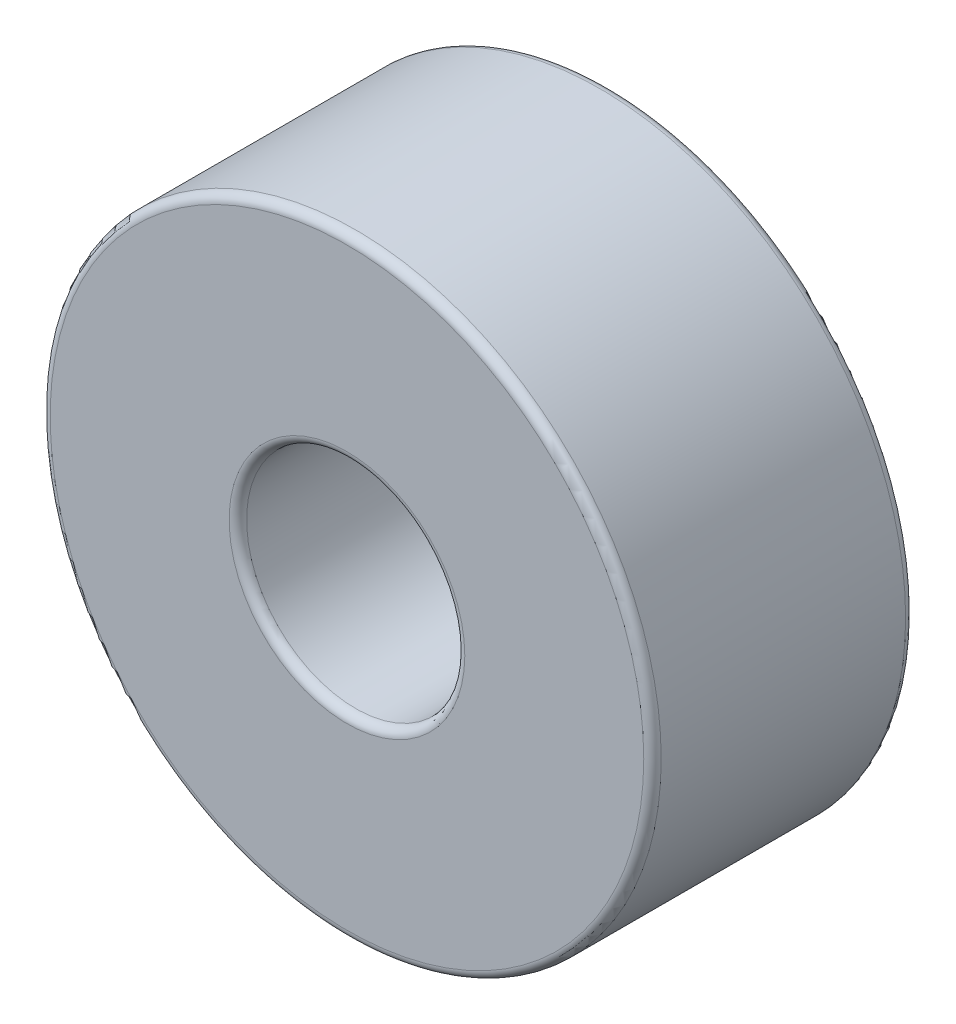
ISO-10303-21;
HEADER;
FILE_DESCRIPTION(('STEP AP214'),'2;1');
FILE_NAME('part.step','',(''),(''),'','','');
FILE_SCHEMA(('AUTOMOTIVE_DESIGN { 1 0 10303 214 1 1 1 1 }'));
ENDSEC;
DATA;
#1=APPLICATION_CONTEXT('core data for automotive mechanical design processes');
#2=APPLICATION_PROTOCOL_DEFINITION('international standard','automotive_design',2000,#1);
#3=PRODUCT_CONTEXT('',#1,'mechanical');
#4=PRODUCT('Part','Part','',(#3));
#5=PRODUCT_RELATED_PRODUCT_CATEGORY('part','',(#4));
#6=PRODUCT_DEFINITION_FORMATION('','',#4);
#7=PRODUCT_DEFINITION_CONTEXT('part definition',#1,'design');
#8=PRODUCT_DEFINITION('design','',#6,#7);
#9=PRODUCT_DEFINITION_SHAPE('','',#8);
#10=(LENGTH_UNIT() NAMED_UNIT(*) SI_UNIT(.MILLI.,.METRE.));
#11=(NAMED_UNIT(*) PLANE_ANGLE_UNIT() SI_UNIT($,.RADIAN.));
#12=(NAMED_UNIT(*) SI_UNIT($,.STERADIAN.) SOLID_ANGLE_UNIT());
#13=UNCERTAINTY_MEASURE_WITH_UNIT(LENGTH_MEASURE(1.E-05),#10,'distance_accuracy_value','');
#14=(GEOMETRIC_REPRESENTATION_CONTEXT(3) GLOBAL_UNCERTAINTY_ASSIGNED_CONTEXT((#13)) GLOBAL_UNIT_ASSIGNED_CONTEXT((#10,
#11,#12)) REPRESENTATION_CONTEXT('',''));
#15=CARTESIAN_POINT('',(0.,0.,0.));
#16=DIRECTION('',(0.,0.,1.));
#17=DIRECTION('',(1.,0.,0.));
#18=AXIS2_PLACEMENT_3D('',#15,#16,#17);
#19=CARTESIAN_POINT('',(0.,0.,6.));
#20=DIRECTION('',(0.,0.,-1.));
#21=DIRECTION('',(-1.,0.,0.));
#22=AXIS2_PLACEMENT_3D('',#19,#20,#21);
#23=CYLINDRICAL_SURFACE('',#22,7.);
#24=CARTESIAN_POINT('',(0.,0.,0.2));
#25=DIRECTION('',(0.,0.,1.));
#26=DIRECTION('',(1.,0.,0.));
#27=AXIS2_PLACEMENT_3D('',#24,#25,#26);
#28=CIRCLE('',#27,7.);
#29=CARTESIAN_POINT('',(7.,0.,0.2));
#30=VERTEX_POINT('',#29);
#31=EDGE_CURVE('E50',#30,#30,#28,.T.);
#32=ORIENTED_EDGE('',*,*,#31,.T.);
#33=EDGE_LOOP('',(#32));
#34=FACE_BOUND('',#33,.T.);
#35=CARTESIAN_POINT('',(0.,0.,5.8));
#36=DIRECTION('',(0.,0.,1.));
#37=DIRECTION('',(1.,0.,0.));
#38=AXIS2_PLACEMENT_3D('',#35,#36,#37);
#39=CIRCLE('',#38,7.);
#40=CARTESIAN_POINT('',(7.,0.,5.8));
#41=VERTEX_POINT('',#40);
#42=EDGE_CURVE('E54',#41,#41,#39,.F.);
#43=ORIENTED_EDGE('',*,*,#42,.T.);
#44=EDGE_LOOP('',(#43));
#45=FACE_BOUND('',#44,.T.);
#46=ADVANCED_FACE('F39',(#34,#45),#23,.T.);
#47=CARTESIAN_POINT('',(0.,0.,6.));
#48=DIRECTION('',(0.,0.,1.));
#49=DIRECTION('',(1.,0.,0.));
#50=AXIS2_PLACEMENT_3D('',#47,#48,#49);
#51=PLANE('',#50);
#52=CARTESIAN_POINT('',(0.,0.,6.));
#53=DIRECTION('',(0.,0.,1.));
#54=DIRECTION('',(1.,0.,0.));
#55=AXIS2_PLACEMENT_3D('',#52,#53,#54);
#56=CIRCLE('',#55,6.8);
#57=CARTESIAN_POINT('',(6.8,0.,6.));
#58=VERTEX_POINT('',#57);
#59=EDGE_CURVE('E10',#58,#58,#56,.T.);
#60=ORIENTED_EDGE('',*,*,#59,.T.);
#61=EDGE_LOOP('',(#60));
#62=FACE_BOUND('',#61,.T.);
#63=CARTESIAN_POINT('',(0.,0.,6.));
#64=DIRECTION('',(0.,0.,1.));
#65=DIRECTION('',(1.,0.,0.));
#66=AXIS2_PLACEMENT_3D('',#63,#64,#65);
#67=CIRCLE('',#66,2.7);
#68=CARTESIAN_POINT('',(2.7,0.,6.));
#69=VERTEX_POINT('',#68);
#70=EDGE_CURVE('E46',#69,#69,#67,.F.);
#71=ORIENTED_EDGE('',*,*,#70,.T.);
#72=EDGE_LOOP('',(#71));
#73=FACE_BOUND('',#72,.T.);
#74=ADVANCED_FACE('F84',(#62,#73),#51,.T.);
#75=CARTESIAN_POINT('',(0.,0.,0.));
#76=DIRECTION('',(0.,0.,1.));
#77=DIRECTION('',(1.,0.,0.));
#78=AXIS2_PLACEMENT_3D('',#75,#76,#77);
#79=PLANE('',#78);
#80=CARTESIAN_POINT('',(0.,0.,0.));
#81=DIRECTION('',(0.,0.,1.));
#82=DIRECTION('',(1.,0.,0.));
#83=AXIS2_PLACEMENT_3D('',#80,#81,#82);
#84=CIRCLE('',#83,2.7);
#85=CARTESIAN_POINT('',(2.7,0.,0.));
#86=VERTEX_POINT('',#85);
#87=EDGE_CURVE('E65',#86,#86,#84,.T.);
#88=ORIENTED_EDGE('',*,*,#87,.T.);
#89=EDGE_LOOP('',(#88));
#90=FACE_BOUND('',#89,.T.);
#91=CARTESIAN_POINT('',(0.,0.,0.));
#92=DIRECTION('',(0.,0.,1.));
#93=DIRECTION('',(1.,0.,0.));
#94=AXIS2_PLACEMENT_3D('',#91,#92,#93);
#95=CIRCLE('',#94,6.8);
#96=CARTESIAN_POINT('',(6.8,0.,0.));
#97=VERTEX_POINT('',#96);
#98=EDGE_CURVE('E68',#97,#97,#95,.F.);
#99=ORIENTED_EDGE('',*,*,#98,.T.);
#100=EDGE_LOOP('',(#99));
#101=FACE_BOUND('',#100,.T.);
#102=ADVANCED_FACE('F72',(#90,#101),#79,.F.);
#103=CARTESIAN_POINT('',(0.,0.,0.));
#104=DIRECTION('',(0.,0.,1.));
#105=DIRECTION('',(1.,0.,0.));
#106=AXIS2_PLACEMENT_3D('',#103,#104,#105);
#107=CYLINDRICAL_SURFACE('',#106,2.5);
#108=CARTESIAN_POINT('',(0.,0.,0.2));
#109=DIRECTION('',(0.,0.,1.));
#110=DIRECTION('',(1.,0.,0.));
#111=AXIS2_PLACEMENT_3D('',#108,#109,#110);
#112=CIRCLE('',#111,2.5);
#113=CARTESIAN_POINT('',(2.5,0.,0.2));
#114=VERTEX_POINT('',#113);
#115=EDGE_CURVE('E59',#114,#114,#112,.F.);
#116=ORIENTED_EDGE('',*,*,#115,.T.);
#117=EDGE_LOOP('',(#116));
#118=FACE_BOUND('',#117,.T.);
#119=CARTESIAN_POINT('',(0.,0.,5.8));
#120=DIRECTION('',(0.,0.,1.));
#121=DIRECTION('',(1.,0.,0.));
#122=AXIS2_PLACEMENT_3D('',#119,#120,#121);
#123=CIRCLE('',#122,2.5);
#124=CARTESIAN_POINT('',(2.5,0.,5.8));
#125=VERTEX_POINT('',#124);
#126=EDGE_CURVE('E62',#125,#125,#123,.T.);
#127=ORIENTED_EDGE('',*,*,#126,.T.);
#128=EDGE_LOOP('',(#127));
#129=FACE_BOUND('',#128,.T.);
#130=ADVANCED_FACE('F96',(#118,#129),#107,.F.);
#131=CARTESIAN_POINT('',(0.,0.,0.2));
#132=DIRECTION('',(0.,0.,1.));
#133=DIRECTION('',(1.,0.,0.));
#134=AXIS2_PLACEMENT_3D('',#131,#132,#133);
#135=TOROIDAL_SURFACE('',#134,2.7,0.2);
#136=ORIENTED_EDGE('',*,*,#115,.F.);
#137=EDGE_LOOP('',(#136));
#138=FACE_BOUND('',#137,.T.);
#139=ORIENTED_EDGE('',*,*,#87,.F.);
#140=EDGE_LOOP('',(#139));
#141=FACE_BOUND('',#140,.T.);
#142=ADVANCED_FACE('F78',(#138,#141),#135,.T.);
#143=CARTESIAN_POINT('',(0.,0.,0.2));
#144=DIRECTION('',(0.,0.,1.));
#145=DIRECTION('',(1.,0.,0.));
#146=AXIS2_PLACEMENT_3D('',#143,#144,#145);
#147=TOROIDAL_SURFACE('',#146,6.8,0.2);
#148=ORIENTED_EDGE('',*,*,#98,.F.);
#149=EDGE_LOOP('',(#148));
#150=FACE_BOUND('',#149,.T.);
#151=ORIENTED_EDGE('',*,*,#31,.F.);
#152=EDGE_LOOP('',(#151));
#153=FACE_BOUND('',#152,.T.);
#154=ADVANCED_FACE('F74',(#150,#153),#147,.T.);
#155=CARTESIAN_POINT('',(0.,0.,5.8));
#156=DIRECTION('',(0.,0.,1.));
#157=DIRECTION('',(1.,0.,0.));
#158=AXIS2_PLACEMENT_3D('',#155,#156,#157);
#159=TOROIDAL_SURFACE('',#158,6.8,0.2);
#160=ORIENTED_EDGE('',*,*,#42,.F.);
#161=EDGE_LOOP('',(#160));
#162=FACE_BOUND('',#161,.T.);
#163=ORIENTED_EDGE('',*,*,#59,.F.);
#164=EDGE_LOOP('',(#163));
#165=FACE_BOUND('',#164,.T.);
#166=ADVANCED_FACE('F77',(#162,#165),#159,.T.);
#167=CARTESIAN_POINT('',(0.,0.,5.8));
#168=DIRECTION('',(0.,0.,1.));
#169=DIRECTION('',(1.,0.,0.));
#170=AXIS2_PLACEMENT_3D('',#167,#168,#169);
#171=TOROIDAL_SURFACE('',#170,2.7,0.2);
#172=ORIENTED_EDGE('',*,*,#70,.F.);
#173=EDGE_LOOP('',(#172));
#174=FACE_BOUND('',#173,.T.);
#175=ORIENTED_EDGE('',*,*,#126,.F.);
#176=EDGE_LOOP('',(#175));
#177=FACE_BOUND('',#176,.T.);
#178=ADVANCED_FACE('F41',(#174,#177),#171,.T.);
#179=CLOSED_SHELL('',(#46,#74,#102,#130,#142,#154,#166,#178));
#180=MANIFOLD_SOLID_BREP('B2',#179);
#181=ADVANCED_BREP_SHAPE_REPRESENTATION('',(#18,#180),#14);
#182=SHAPE_DEFINITION_REPRESENTATION(#9,#181);
ENDSEC;
END-ISO-10303-21;
